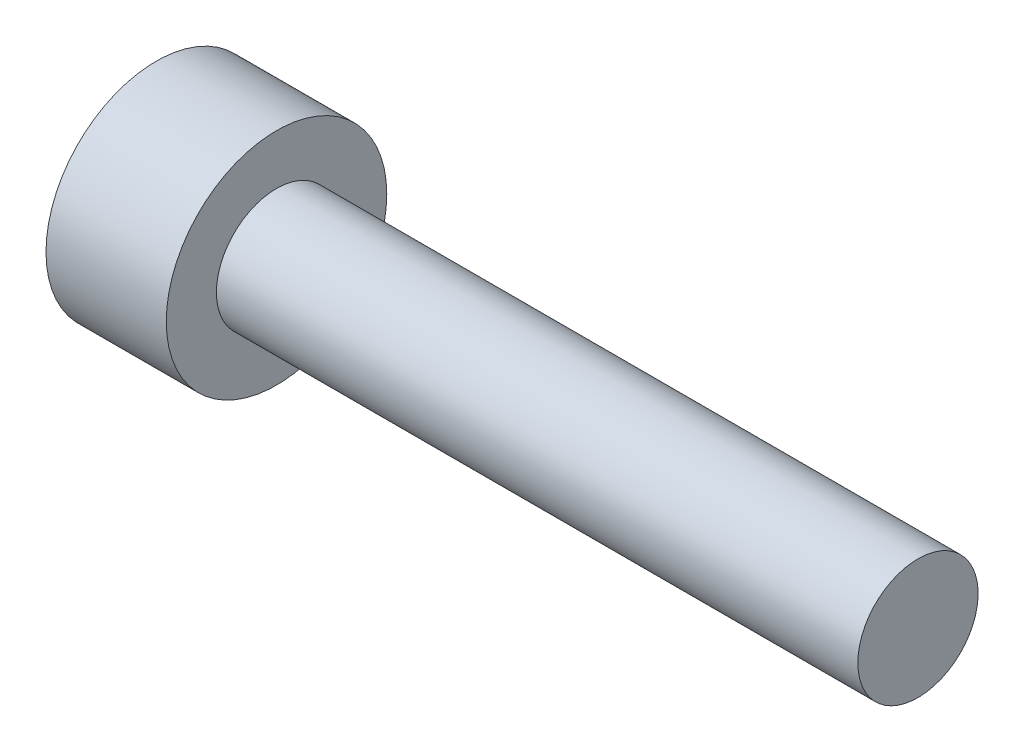
ISO-10303-21;
HEADER;
FILE_DESCRIPTION(('STEP AP214'),'2;1');
FILE_NAME('part.step','',(''),(''),'','','');
FILE_SCHEMA(('AUTOMOTIVE_DESIGN { 1 0 10303 214 1 1 1 1 }'));
ENDSEC;
DATA;
#1=APPLICATION_CONTEXT('core data for automotive mechanical design processes');
#2=APPLICATION_PROTOCOL_DEFINITION('international standard','automotive_design',2000,#1);
#3=PRODUCT_CONTEXT('',#1,'mechanical');
#4=PRODUCT('Part','Part','',(#3));
#5=PRODUCT_RELATED_PRODUCT_CATEGORY('part','',(#4));
#6=PRODUCT_DEFINITION_FORMATION('','',#4);
#7=PRODUCT_DEFINITION_CONTEXT('part definition',#1,'design');
#8=PRODUCT_DEFINITION('design','',#6,#7);
#9=PRODUCT_DEFINITION_SHAPE('','',#8);
#10=(LENGTH_UNIT() NAMED_UNIT(*) SI_UNIT(.MILLI.,.METRE.));
#11=(NAMED_UNIT(*) PLANE_ANGLE_UNIT() SI_UNIT($,.RADIAN.));
#12=(NAMED_UNIT(*) SI_UNIT($,.STERADIAN.) SOLID_ANGLE_UNIT());
#13=UNCERTAINTY_MEASURE_WITH_UNIT(LENGTH_MEASURE(1.E-05),#10,'distance_accuracy_value','');
#14=(GEOMETRIC_REPRESENTATION_CONTEXT(3) GLOBAL_UNCERTAINTY_ASSIGNED_CONTEXT((#13)) GLOBAL_UNIT_ASSIGNED_CONTEXT((#10,
#11,#12)) REPRESENTATION_CONTEXT('',''));
#15=CARTESIAN_POINT('',(0.,0.,0.));
#16=DIRECTION('',(0.,0.,1.));
#17=DIRECTION('',(1.,0.,0.));
#18=AXIS2_PLACEMENT_3D('',#15,#16,#17);
#19=CARTESIAN_POINT('',(-3.,0.,0.));
#20=DIRECTION('',(1.,0.,0.));
#21=DIRECTION('',(0.,0.,-1.));
#22=AXIS2_PLACEMENT_3D('',#19,#20,#21);
#23=PLANE('',#22);
#24=CARTESIAN_POINT('',(-3.,0.,0.));
#25=DIRECTION('',(-1.,0.,0.));
#26=DIRECTION('',(0.,0.,1.));
#27=AXIS2_PLACEMENT_3D('',#24,#25,#26);
#28=CIRCLE('',#27,2.75);
#29=CARTESIAN_POINT('',(-3.,0.,2.75));
#30=VERTEX_POINT('',#29);
#31=EDGE_CURVE('E11',#30,#30,#28,.T.);
#32=ORIENTED_EDGE('',*,*,#31,.T.);
#33=EDGE_LOOP('',(#32));
#34=FACE_BOUND('',#33,.T.);
#35=DIRECTION('',(0.,0.866025403784439,-0.5));
#36=VECTOR('',#35,1.);
#37=CARTESIAN_POINT('',(-3.,-1.25,-0.721687836487032));
#38=LINE('',#37,#36);
#39=CARTESIAN_POINT('',(-3.,-1.25,-0.721687836487032));
#40=VERTEX_POINT('',#39);
#41=CARTESIAN_POINT('',(-3.,0.,-1.44337567297406));
#42=VERTEX_POINT('',#41);
#43=EDGE_CURVE('E54',#40,#42,#38,.T.);
#44=ORIENTED_EDGE('',*,*,#43,.T.);
#45=DIRECTION('',(0.,0.866025403784439,0.5));
#46=VECTOR('',#45,1.);
#47=CARTESIAN_POINT('',(-3.,0.,-1.44337567297406));
#48=LINE('',#47,#46);
#49=CARTESIAN_POINT('',(-3.,1.25,-0.721687836487032));
#50=VERTEX_POINT('',#49);
#51=EDGE_CURVE('E127',#42,#50,#48,.T.);
#52=ORIENTED_EDGE('',*,*,#51,.T.);
#53=DIRECTION('',(0.,0.,1.));
#54=VECTOR('',#53,1.);
#55=CARTESIAN_POINT('',(-3.,1.25,-0.721687836487032));
#56=LINE('',#55,#54);
#57=CARTESIAN_POINT('',(-3.,1.25,0.721687836487032));
#58=VERTEX_POINT('',#57);
#59=EDGE_CURVE('E129',#50,#58,#56,.T.);
#60=ORIENTED_EDGE('',*,*,#59,.T.);
#61=DIRECTION('',(0.,-0.866025403784439,0.5));
#62=VECTOR('',#61,1.);
#63=CARTESIAN_POINT('',(-3.,1.25,0.721687836487032));
#64=LINE('',#63,#62);
#65=CARTESIAN_POINT('',(-3.,0.,1.44337567297406));
#66=VERTEX_POINT('',#65);
#67=EDGE_CURVE('E135',#58,#66,#64,.T.);
#68=ORIENTED_EDGE('',*,*,#67,.T.);
#69=DIRECTION('',(0.,-0.866025403784439,-0.5));
#70=VECTOR('',#69,1.);
#71=CARTESIAN_POINT('',(-3.,0.,1.44337567297406));
#72=LINE('',#71,#70);
#73=CARTESIAN_POINT('',(-3.,-1.25,0.721687836487033));
#74=VERTEX_POINT('',#73);
#75=EDGE_CURVE('E116',#66,#74,#72,.T.);
#76=ORIENTED_EDGE('',*,*,#75,.T.);
#77=DIRECTION('',(0.,0.,-1.));
#78=VECTOR('',#77,1.);
#79=CARTESIAN_POINT('',(-3.,-1.25,0.721687836487033));
#80=LINE('',#79,#78);
#81=EDGE_CURVE('E134',#74,#40,#80,.T.);
#82=ORIENTED_EDGE('',*,*,#81,.T.);
#83=EDGE_LOOP('',(#44,#52,#60,#68,#76,#82));
#84=FACE_BOUND('',#83,.T.);
#85=ADVANCED_FACE('F41',(#34,#84),#23,.F.);
#86=CARTESIAN_POINT('',(-1000.,0.,0.));
#87=DIRECTION('',(-1.,0.,0.));
#88=DIRECTION('',(0.,0.,1.));
#89=AXIS2_PLACEMENT_3D('',#86,#87,#88);
#90=CYLINDRICAL_SURFACE('',#89,2.75);
#91=ORIENTED_EDGE('',*,*,#31,.F.);
#92=EDGE_LOOP('',(#91));
#93=FACE_BOUND('',#92,.T.);
#94=CARTESIAN_POINT('',(0.,0.,0.));
#95=DIRECTION('',(-1.,0.,0.));
#96=DIRECTION('',(0.,0.,1.));
#97=AXIS2_PLACEMENT_3D('',#94,#95,#96);
#98=CIRCLE('',#97,2.75);
#99=CARTESIAN_POINT('',(0.,0.,2.75));
#100=VERTEX_POINT('',#99);
#101=EDGE_CURVE('E48',#100,#100,#98,.T.);
#102=ORIENTED_EDGE('',*,*,#101,.T.);
#103=EDGE_LOOP('',(#102));
#104=FACE_BOUND('',#103,.T.);
#105=ADVANCED_FACE('F152',(#93,#104),#90,.T.);
#106=CARTESIAN_POINT('',(0.,2.75,0.));
#107=DIRECTION('',(-1.,0.,0.));
#108=DIRECTION('',(0.,0.,1.));
#109=AXIS2_PLACEMENT_3D('',#106,#107,#108);
#110=PLANE('',#109);
#111=ORIENTED_EDGE('',*,*,#101,.F.);
#112=EDGE_LOOP('',(#111));
#113=FACE_BOUND('',#112,.T.);
#114=CARTESIAN_POINT('',(0.,0.,0.));
#115=DIRECTION('',(-1.,0.,0.));
#116=DIRECTION('',(0.,0.,1.));
#117=AXIS2_PLACEMENT_3D('',#114,#115,#116);
#118=CIRCLE('',#117,1.5);
#119=CARTESIAN_POINT('',(0.,0.,1.5));
#120=VERTEX_POINT('',#119);
#121=EDGE_CURVE('E149',#120,#120,#118,.T.);
#122=ORIENTED_EDGE('',*,*,#121,.T.);
#123=EDGE_LOOP('',(#122));
#124=FACE_BOUND('',#123,.T.);
#125=ADVANCED_FACE('F156',(#113,#124),#110,.F.);
#126=CARTESIAN_POINT('',(-1000.,0.,0.));
#127=DIRECTION('',(-1.,0.,0.));
#128=DIRECTION('',(0.,0.,1.));
#129=AXIS2_PLACEMENT_3D('',#126,#127,#128);
#130=CYLINDRICAL_SURFACE('',#129,1.5);
#131=ORIENTED_EDGE('',*,*,#121,.F.);
#132=EDGE_LOOP('',(#131));
#133=FACE_BOUND('',#132,.T.);
#134=CARTESIAN_POINT('',(16.,0.,0.));
#135=DIRECTION('',(-1.,0.,0.));
#136=DIRECTION('',(0.,0.,1.));
#137=AXIS2_PLACEMENT_3D('',#134,#135,#136);
#138=CIRCLE('',#137,1.5);
#139=CARTESIAN_POINT('',(16.,0.,1.5));
#140=VERTEX_POINT('',#139);
#141=EDGE_CURVE('E148',#140,#140,#138,.T.);
#142=ORIENTED_EDGE('',*,*,#141,.T.);
#143=EDGE_LOOP('',(#142));
#144=FACE_BOUND('',#143,.T.);
#145=ADVANCED_FACE('F157',(#133,#144),#130,.T.);
#146=CARTESIAN_POINT('',(16.,1.5,0.));
#147=DIRECTION('',(-1.,0.,0.));
#148=DIRECTION('',(0.,0.,1.));
#149=AXIS2_PLACEMENT_3D('',#146,#147,#148);
#150=PLANE('',#149);
#151=ORIENTED_EDGE('',*,*,#141,.F.);
#152=EDGE_LOOP('',(#151));
#153=FACE_BOUND('',#152,.T.);
#154=ADVANCED_FACE('F164',(#153),#150,.F.);
#155=CARTESIAN_POINT('',(-1.5,-1.25,-0.721687836487032));
#156=DIRECTION('',(0.,0.5,0.866025403784439));
#157=DIRECTION('',(0.,-0.866025403784439,0.5));
#158=AXIS2_PLACEMENT_3D('',#155,#156,#157);
#159=PLANE('',#158);
#160=ORIENTED_EDGE('',*,*,#43,.F.);
#161=DIRECTION('',(-1.,0.,0.));
#162=VECTOR('',#161,1.);
#163=CARTESIAN_POINT('',(-1.5,-1.25,-0.721687836487032));
#164=LINE('',#163,#162);
#165=CARTESIAN_POINT('',(-1.5,-1.25,-0.721687836487032));
#166=VERTEX_POINT('',#165);
#167=EDGE_CURVE('E121',#166,#40,#164,.T.);
#168=ORIENTED_EDGE('',*,*,#167,.F.);
#169=DIRECTION('',(0.,0.866025403784439,-0.5));
#170=VECTOR('',#169,1.);
#171=CARTESIAN_POINT('',(-1.5,-1.25,-0.721687836487032));
#172=LINE('',#171,#170);
#173=CARTESIAN_POINT('',(-1.5,0.,-1.44337567297406));
#174=VERTEX_POINT('',#173);
#175=EDGE_CURVE('E137',#166,#174,#172,.T.);
#176=ORIENTED_EDGE('',*,*,#175,.T.);
#177=DIRECTION('',(-1.,0.,0.));
#178=VECTOR('',#177,1.);
#179=CARTESIAN_POINT('',(-1.5,0.,-1.44337567297406));
#180=LINE('',#179,#178);
#181=EDGE_CURVE('E145',#174,#42,#180,.T.);
#182=ORIENTED_EDGE('',*,*,#181,.T.);
#183=EDGE_LOOP('',(#160,#168,#176,#182));
#184=FACE_BOUND('',#183,.T.);
#185=ADVANCED_FACE('F168',(#184),#159,.T.);
#186=CARTESIAN_POINT('',(-1.5,0.,-1.44337567297406));
#187=DIRECTION('',(0.,-0.5,0.866025403784439));
#188=DIRECTION('',(0.,-0.866025403784439,-0.5));
#189=AXIS2_PLACEMENT_3D('',#186,#187,#188);
#190=PLANE('',#189);
#191=ORIENTED_EDGE('',*,*,#51,.F.);
#192=ORIENTED_EDGE('',*,*,#181,.F.);
#193=DIRECTION('',(0.,0.866025403784439,0.5));
#194=VECTOR('',#193,1.);
#195=CARTESIAN_POINT('',(-1.5,0.,-1.44337567297406));
#196=LINE('',#195,#194);
#197=CARTESIAN_POINT('',(-1.5,1.25,-0.721687836487032));
#198=VERTEX_POINT('',#197);
#199=EDGE_CURVE('E94',#174,#198,#196,.T.);
#200=ORIENTED_EDGE('',*,*,#199,.T.);
#201=DIRECTION('',(-1.,0.,0.));
#202=VECTOR('',#201,1.);
#203=CARTESIAN_POINT('',(-1.5,1.25,-0.721687836487032));
#204=LINE('',#203,#202);
#205=EDGE_CURVE('E142',#198,#50,#204,.T.);
#206=ORIENTED_EDGE('',*,*,#205,.T.);
#207=EDGE_LOOP('',(#191,#192,#200,#206));
#208=FACE_BOUND('',#207,.T.);
#209=ADVANCED_FACE('F176',(#208),#190,.T.);
#210=CARTESIAN_POINT('',(-1.5,1.25,-0.721687836487032));
#211=DIRECTION('',(0.,-1.,0.));
#212=DIRECTION('',(0.,0.,-1.));
#213=AXIS2_PLACEMENT_3D('',#210,#211,#212);
#214=PLANE('',#213);
#215=ORIENTED_EDGE('',*,*,#59,.F.);
#216=ORIENTED_EDGE('',*,*,#205,.F.);
#217=DIRECTION('',(0.,0.,1.));
#218=VECTOR('',#217,1.);
#219=CARTESIAN_POINT('',(-1.5,1.25,-0.721687836487032));
#220=LINE('',#219,#218);
#221=CARTESIAN_POINT('',(-1.5,1.25,0.721687836487032));
#222=VERTEX_POINT('',#221);
#223=EDGE_CURVE('E115',#198,#222,#220,.T.);
#224=ORIENTED_EDGE('',*,*,#223,.T.);
#225=DIRECTION('',(-1.,0.,0.));
#226=VECTOR('',#225,1.);
#227=CARTESIAN_POINT('',(-1.5,1.25,0.721687836487032));
#228=LINE('',#227,#226);
#229=EDGE_CURVE('E108',#222,#58,#228,.T.);
#230=ORIENTED_EDGE('',*,*,#229,.T.);
#231=EDGE_LOOP('',(#215,#216,#224,#230));
#232=FACE_BOUND('',#231,.T.);
#233=ADVANCED_FACE('F195',(#232),#214,.T.);
#234=CARTESIAN_POINT('',(-1.5,1.25,0.721687836487032));
#235=DIRECTION('',(0.,-0.5,-0.866025403784438));
#236=DIRECTION('',(0.,0.866025403784439,-0.5));
#237=AXIS2_PLACEMENT_3D('',#234,#235,#236);
#238=PLANE('',#237);
#239=ORIENTED_EDGE('',*,*,#67,.F.);
#240=ORIENTED_EDGE('',*,*,#229,.F.);
#241=DIRECTION('',(0.,-0.866025403784439,0.5));
#242=VECTOR('',#241,1.);
#243=CARTESIAN_POINT('',(-1.5,1.25,0.721687836487032));
#244=LINE('',#243,#242);
#245=CARTESIAN_POINT('',(-1.5,0.,1.44337567297406));
#246=VERTEX_POINT('',#245);
#247=EDGE_CURVE('E102',#222,#246,#244,.T.);
#248=ORIENTED_EDGE('',*,*,#247,.T.);
#249=DIRECTION('',(-1.,0.,0.));
#250=VECTOR('',#249,1.);
#251=CARTESIAN_POINT('',(-1.5,0.,1.44337567297406));
#252=LINE('',#251,#250);
#253=EDGE_CURVE('E107',#246,#66,#252,.T.);
#254=ORIENTED_EDGE('',*,*,#253,.T.);
#255=EDGE_LOOP('',(#239,#240,#248,#254));
#256=FACE_BOUND('',#255,.T.);
#257=ADVANCED_FACE('F110',(#256),#238,.T.);
#258=CARTESIAN_POINT('',(-1.5,0.,1.44337567297406));
#259=DIRECTION('',(0.,0.5,-0.866025403784439));
#260=DIRECTION('',(0.,0.866025403784439,0.5));
#261=AXIS2_PLACEMENT_3D('',#258,#259,#260);
#262=PLANE('',#261);
#263=ORIENTED_EDGE('',*,*,#75,.F.);
#264=ORIENTED_EDGE('',*,*,#253,.F.);
#265=DIRECTION('',(0.,-0.866025403784439,-0.5));
#266=VECTOR('',#265,1.);
#267=CARTESIAN_POINT('',(-1.5,0.,1.44337567297406));
#268=LINE('',#267,#266);
#269=CARTESIAN_POINT('',(-1.5,-1.25,0.721687836487033));
#270=VERTEX_POINT('',#269);
#271=EDGE_CURVE('E112',#246,#270,#268,.T.);
#272=ORIENTED_EDGE('',*,*,#271,.T.);
#273=DIRECTION('',(-1.,0.,0.));
#274=VECTOR('',#273,1.);
#275=CARTESIAN_POINT('',(-1.5,-1.25,0.721687836487033));
#276=LINE('',#275,#274);
#277=EDGE_CURVE('E84',#270,#74,#276,.T.);
#278=ORIENTED_EDGE('',*,*,#277,.T.);
#279=EDGE_LOOP('',(#263,#264,#272,#278));
#280=FACE_BOUND('',#279,.T.);
#281=ADVANCED_FACE('F111',(#280),#262,.T.);
#282=CARTESIAN_POINT('',(-1.5,-1.25,0.721687836487033));
#283=DIRECTION('',(0.,1.,0.));
#284=DIRECTION('',(0.,0.,1.));
#285=AXIS2_PLACEMENT_3D('',#282,#283,#284);
#286=PLANE('',#285);
#287=ORIENTED_EDGE('',*,*,#81,.F.);
#288=ORIENTED_EDGE('',*,*,#277,.F.);
#289=DIRECTION('',(0.,0.,-1.));
#290=VECTOR('',#289,1.);
#291=CARTESIAN_POINT('',(-1.5,-1.25,0.721687836487033));
#292=LINE('',#291,#290);
#293=EDGE_CURVE('E62',#270,#166,#292,.T.);
#294=ORIENTED_EDGE('',*,*,#293,.T.);
#295=ORIENTED_EDGE('',*,*,#167,.T.);
#296=EDGE_LOOP('',(#287,#288,#294,#295));
#297=FACE_BOUND('',#296,.T.);
#298=ADVANCED_FACE('F183',(#297),#286,.T.);
#299=CARTESIAN_POINT('',(-1.5,0.,0.));
#300=DIRECTION('',(1.,0.,0.));
#301=DIRECTION('',(0.,0.,-1.));
#302=AXIS2_PLACEMENT_3D('',#299,#300,#301);
#303=PLANE('',#302);
#304=ORIENTED_EDGE('',*,*,#175,.F.);
#305=ORIENTED_EDGE('',*,*,#293,.F.);
#306=ORIENTED_EDGE('',*,*,#271,.F.);
#307=ORIENTED_EDGE('',*,*,#247,.F.);
#308=ORIENTED_EDGE('',*,*,#223,.F.);
#309=ORIENTED_EDGE('',*,*,#199,.F.);
#310=EDGE_LOOP('',(#304,#305,#306,#307,#308,#309));
#311=FACE_BOUND('',#310,.T.);
#312=ADVANCED_FACE('F118',(#311),#303,.F.);
#313=CLOSED_SHELL('',(#85,#105,#125,#145,#154,#185,#209,#233,#257,#281,#298,#312));
#314=MANIFOLD_SOLID_BREP('B2',#313);
#315=ADVANCED_BREP_SHAPE_REPRESENTATION('',(#18,#314),#14);
#316=SHAPE_DEFINITION_REPRESENTATION(#9,#315);
ENDSEC;
END-ISO-10303-21;
